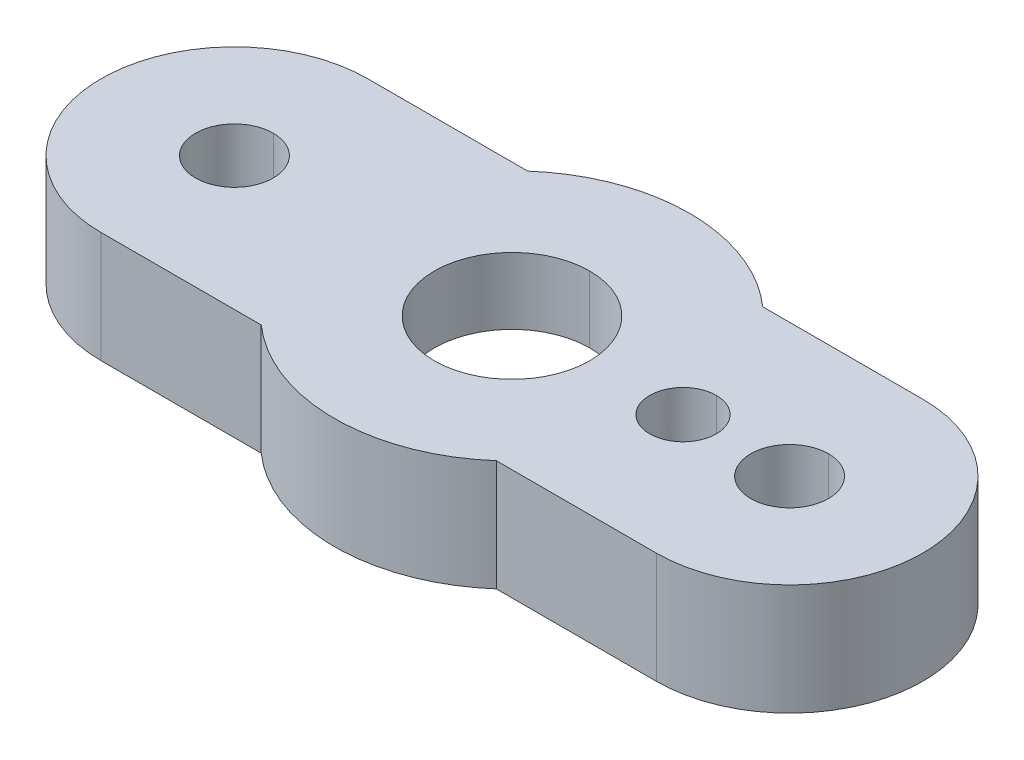
ISO-10303-21;
HEADER;
FILE_DESCRIPTION(('STEP AP214'),'2;1');
FILE_NAME('part.step','',(''),(''),'','','');
FILE_SCHEMA(('AUTOMOTIVE_DESIGN { 1 0 10303 214 1 1 1 1 }'));
ENDSEC;
DATA;
#1=APPLICATION_CONTEXT('core data for automotive mechanical design processes');
#2=APPLICATION_PROTOCOL_DEFINITION('international standard','automotive_design',2000,#1);
#3=PRODUCT_CONTEXT('',#1,'mechanical');
#4=PRODUCT('Part','Part','',(#3));
#5=PRODUCT_RELATED_PRODUCT_CATEGORY('part','',(#4));
#6=PRODUCT_DEFINITION_FORMATION('','',#4);
#7=PRODUCT_DEFINITION_CONTEXT('part definition',#1,'design');
#8=PRODUCT_DEFINITION('design','',#6,#7);
#9=PRODUCT_DEFINITION_SHAPE('','',#8);
#10=(LENGTH_UNIT() NAMED_UNIT(*) SI_UNIT(.MILLI.,.METRE.));
#11=(NAMED_UNIT(*) PLANE_ANGLE_UNIT() SI_UNIT($,.RADIAN.));
#12=(NAMED_UNIT(*) SI_UNIT($,.STERADIAN.) SOLID_ANGLE_UNIT());
#13=UNCERTAINTY_MEASURE_WITH_UNIT(LENGTH_MEASURE(1.E-05),#10,'distance_accuracy_value','');
#14=(GEOMETRIC_REPRESENTATION_CONTEXT(3) GLOBAL_UNCERTAINTY_ASSIGNED_CONTEXT((#13)) GLOBAL_UNIT_ASSIGNED_CONTEXT((#10,
#11,#12)) REPRESENTATION_CONTEXT('',''));
#15=CARTESIAN_POINT('',(0.,0.,0.));
#16=DIRECTION('',(0.,0.,1.));
#17=DIRECTION('',(1.,0.,0.));
#18=AXIS2_PLACEMENT_3D('',#15,#16,#17);
#19=CARTESIAN_POINT('',(7.7,-0.00100000000000013,0.));
#20=DIRECTION('',(0.,1.,0.));
#21=DIRECTION('',(0.,0.,1.));
#22=AXIS2_PLACEMENT_3D('',#19,#20,#21);
#23=CYLINDRICAL_SURFACE('',#22,1.5);
#24=DIRECTION('',(0.,1.,0.));
#25=VECTOR('',#24,1.);
#26=CARTESIAN_POINT('',(7.7,-0.00100000000000013,-1.5));
#27=LINE('',#26,#25);
#28=CARTESIAN_POINT('',(7.7,0.,-1.5));
#29=VERTEX_POINT('',#28);
#30=CARTESIAN_POINT('',(7.7,5.,-1.5));
#31=VERTEX_POINT('',#30);
#32=EDGE_CURVE('E241',#29,#31,#27,.T.);
#33=ORIENTED_EDGE('',*,*,#32,.F.);
#34=CARTESIAN_POINT('',(7.7,0.,0.));
#35=DIRECTION('',(0.,-1.,0.));
#36=DIRECTION('',(0.,0.,1.));
#37=AXIS2_PLACEMENT_3D('',#34,#35,#36);
#38=CIRCLE('',#37,1.5);
#39=CARTESIAN_POINT('',(7.7,0.,1.5));
#40=VERTEX_POINT('',#39);
#41=EDGE_CURVE('E238',#29,#40,#38,.T.);
#42=ORIENTED_EDGE('',*,*,#41,.T.);
#43=DIRECTION('',(0.,1.,0.));
#44=VECTOR('',#43,1.);
#45=CARTESIAN_POINT('',(7.7,-0.00100000000000013,1.5));
#46=LINE('',#45,#44);
#47=CARTESIAN_POINT('',(7.7,5.,1.5));
#48=VERTEX_POINT('',#47);
#49=EDGE_CURVE('E256',#40,#48,#46,.T.);
#50=ORIENTED_EDGE('',*,*,#49,.T.);
#51=CARTESIAN_POINT('',(7.7,5.,0.));
#52=DIRECTION('',(0.,1.,0.));
#53=DIRECTION('',(0.,0.,1.));
#54=AXIS2_PLACEMENT_3D('',#51,#52,#53);
#55=CIRCLE('',#54,1.5);
#56=EDGE_CURVE('E403',#48,#31,#55,.T.);
#57=ORIENTED_EDGE('',*,*,#56,.T.);
#58=EDGE_LOOP('',(#33,#42,#50,#57));
#59=FACE_BOUND('',#58,.T.);
#60=ADVANCED_FACE('F17',(#59),#23,.F.);
#61=CARTESIAN_POINT('',(-12.5,22.8455709626008,0.));
#62=DIRECTION('',(0.,-1.,0.));
#63=DIRECTION('',(0.,0.,-1.));
#64=AXIS2_PLACEMENT_3D('',#61,#62,#63);
#65=CYLINDRICAL_SURFACE('',#64,1.75);
#66=DIRECTION('',(0.,-1.,0.));
#67=VECTOR('',#66,1.);
#68=CARTESIAN_POINT('',(-12.5,22.8455709626008,1.75));
#69=LINE('',#68,#67);
#70=CARTESIAN_POINT('',(-12.5,5.,1.75));
#71=VERTEX_POINT('',#70);
#72=CARTESIAN_POINT('',(-12.5,0.,1.75));
#73=VERTEX_POINT('',#72);
#74=EDGE_CURVE('E297',#71,#73,#69,.T.);
#75=ORIENTED_EDGE('',*,*,#74,.F.);
#76=CARTESIAN_POINT('',(-12.5,5.,0.));
#77=DIRECTION('',(0.,-1.,0.));
#78=DIRECTION('',(0.,0.,1.));
#79=AXIS2_PLACEMENT_3D('',#76,#77,#78);
#80=CIRCLE('',#79,1.75);
#81=CARTESIAN_POINT('',(-12.5,5.,-1.75));
#82=VERTEX_POINT('',#81);
#83=EDGE_CURVE('E409',#82,#71,#80,.T.);
#84=ORIENTED_EDGE('',*,*,#83,.F.);
#85=DIRECTION('',(0.,-1.,0.));
#86=VECTOR('',#85,1.);
#87=CARTESIAN_POINT('',(-12.5,22.8455709626008,-1.75));
#88=LINE('',#87,#86);
#89=CARTESIAN_POINT('',(-12.5,0.,-1.75));
#90=VERTEX_POINT('',#89);
#91=EDGE_CURVE('E271',#82,#90,#88,.T.);
#92=ORIENTED_EDGE('',*,*,#91,.T.);
#93=CARTESIAN_POINT('',(-12.5,0.,0.));
#94=DIRECTION('',(0.,-1.,0.));
#95=DIRECTION('',(0.,0.,-1.));
#96=AXIS2_PLACEMENT_3D('',#93,#94,#95);
#97=CIRCLE('',#96,1.75);
#98=EDGE_CURVE('E355',#90,#73,#97,.T.);
#99=ORIENTED_EDGE('',*,*,#98,.T.);
#100=EDGE_LOOP('',(#75,#84,#92,#99));
#101=FACE_BOUND('',#100,.T.);
#102=ADVANCED_FACE('F466',(#101),#65,.F.);
#103=CARTESIAN_POINT('',(-12.5,22.8455709626008,-6.));
#104=DIRECTION('',(0.,0.,-1.));
#105=DIRECTION('',(0.,-1.,0.));
#106=AXIS2_PLACEMENT_3D('',#103,#104,#105);
#107=PLANE('',#106);
#108=DIRECTION('',(0.,-1.,0.));
#109=VECTOR('',#108,1.);
#110=CARTESIAN_POINT('',(-12.5,22.8455709626008,-6.));
#111=LINE('',#110,#109);
#112=CARTESIAN_POINT('',(-12.5,5.,-6.));
#113=VERTEX_POINT('',#112);
#114=CARTESIAN_POINT('',(-12.5,0.,-6.));
#115=VERTEX_POINT('',#114);
#116=EDGE_CURVE('E11',#113,#115,#111,.T.);
#117=ORIENTED_EDGE('',*,*,#116,.F.);
#118=DIRECTION('',(1.,0.,0.));
#119=VECTOR('',#118,1.);
#120=CARTESIAN_POINT('',(-12.5,5.,-6.));
#121=LINE('',#120,#119);
#122=CARTESIAN_POINT('',(-5.29150262212918,5.,-6.));
#123=VERTEX_POINT('',#122);
#124=EDGE_CURVE('E383',#113,#123,#121,.T.);
#125=ORIENTED_EDGE('',*,*,#124,.T.);
#126=DIRECTION('',(0.,-1.,0.));
#127=VECTOR('',#126,1.);
#128=CARTESIAN_POINT('',(-5.29150262212918,22.8455709626008,-6.));
#129=LINE('',#128,#127);
#130=CARTESIAN_POINT('',(-5.29150262212918,0.,-6.));
#131=VERTEX_POINT('',#130);
#132=EDGE_CURVE('E315',#123,#131,#129,.T.);
#133=ORIENTED_EDGE('',*,*,#132,.T.);
#134=DIRECTION('',(1.,0.,0.));
#135=VECTOR('',#134,1.);
#136=CARTESIAN_POINT('',(-12.5,0.,-6.));
#137=LINE('',#136,#135);
#138=EDGE_CURVE('E252',#115,#131,#137,.T.);
#139=ORIENTED_EDGE('',*,*,#138,.F.);
#140=EDGE_LOOP('',(#117,#125,#133,#139));
#141=FACE_BOUND('',#140,.T.);
#142=ADVANCED_FACE('F471',(#141),#107,.T.);
#143=CARTESIAN_POINT('',(-5.29150262212918,22.8455709626008,6.));
#144=DIRECTION('',(0.,0.,1.));
#145=DIRECTION('',(1.,0.,0.));
#146=AXIS2_PLACEMENT_3D('',#143,#144,#145);
#147=PLANE('',#146);
#148=DIRECTION('',(0.,-1.,0.));
#149=VECTOR('',#148,1.);
#150=CARTESIAN_POINT('',(-5.29150262212918,22.8455709626008,6.));
#151=LINE('',#150,#149);
#152=CARTESIAN_POINT('',(-5.29150262212918,5.,6.));
#153=VERTEX_POINT('',#152);
#154=CARTESIAN_POINT('',(-5.29150262212918,0.,6.));
#155=VERTEX_POINT('',#154);
#156=EDGE_CURVE('E367',#153,#155,#151,.T.);
#157=ORIENTED_EDGE('',*,*,#156,.F.);
#158=DIRECTION('',(-1.,0.,0.));
#159=VECTOR('',#158,1.);
#160=CARTESIAN_POINT('',(-5.29150262212918,5.,6.));
#161=LINE('',#160,#159);
#162=CARTESIAN_POINT('',(-12.5,5.,6.));
#163=VERTEX_POINT('',#162);
#164=EDGE_CURVE('E389',#153,#163,#161,.T.);
#165=ORIENTED_EDGE('',*,*,#164,.T.);
#166=DIRECTION('',(0.,-1.,0.));
#167=VECTOR('',#166,1.);
#168=CARTESIAN_POINT('',(-12.5,22.8455709626008,6.));
#169=LINE('',#168,#167);
#170=CARTESIAN_POINT('',(-12.5,0.,6.));
#171=VERTEX_POINT('',#170);
#172=EDGE_CURVE('E20',#163,#171,#169,.T.);
#173=ORIENTED_EDGE('',*,*,#172,.T.);
#174=DIRECTION('',(-1.,0.,0.));
#175=VECTOR('',#174,1.);
#176=CARTESIAN_POINT('',(-5.29150262212918,0.,6.));
#177=LINE('',#176,#175);
#178=EDGE_CURVE('E426',#155,#171,#177,.T.);
#179=ORIENTED_EDGE('',*,*,#178,.F.);
#180=EDGE_LOOP('',(#157,#165,#173,#179));
#181=FACE_BOUND('',#180,.T.);
#182=ADVANCED_FACE('F475',(#181),#147,.T.);
#183=CARTESIAN_POINT('',(-12.5,22.8455709626008,0.));
#184=DIRECTION('',(0.,-1.,0.));
#185=DIRECTION('',(0.,0.,-1.));
#186=AXIS2_PLACEMENT_3D('',#183,#184,#185);
#187=CYLINDRICAL_SURFACE('',#186,6.);
#188=ORIENTED_EDGE('',*,*,#172,.F.);
#189=CARTESIAN_POINT('',(-12.5,5.,0.));
#190=DIRECTION('',(0.,-1.,0.));
#191=DIRECTION('',(0.,0.,1.));
#192=AXIS2_PLACEMENT_3D('',#189,#190,#191);
#193=CIRCLE('',#192,6.);
#194=EDGE_CURVE('E386',#163,#113,#193,.T.);
#195=ORIENTED_EDGE('',*,*,#194,.T.);
#196=ORIENTED_EDGE('',*,*,#116,.T.);
#197=CARTESIAN_POINT('',(-12.5,0.,0.));
#198=DIRECTION('',(0.,-1.,0.));
#199=DIRECTION('',(0.,0.,-1.));
#200=AXIS2_PLACEMENT_3D('',#197,#198,#199);
#201=CIRCLE('',#200,6.);
#202=EDGE_CURVE('E430',#171,#115,#201,.T.);
#203=ORIENTED_EDGE('',*,*,#202,.F.);
#204=EDGE_LOOP('',(#188,#195,#196,#203));
#205=FACE_BOUND('',#204,.T.);
#206=ADVANCED_FACE('F483',(#205),#187,.T.);
#207=CARTESIAN_POINT('',(12.5,22.8455709626008,0.));
#208=DIRECTION('',(0.,-1.,0.));
#209=DIRECTION('',(0.,0.,-1.));
#210=AXIS2_PLACEMENT_3D('',#207,#208,#209);
#211=CYLINDRICAL_SURFACE('',#210,1.75);
#212=DIRECTION('',(0.,-1.,0.));
#213=VECTOR('',#212,1.);
#214=CARTESIAN_POINT('',(12.5,22.8455709626008,1.75));
#215=LINE('',#214,#213);
#216=CARTESIAN_POINT('',(12.5,5.,1.75));
#217=VERTEX_POINT('',#216);
#218=CARTESIAN_POINT('',(12.5,0.,1.75));
#219=VERTEX_POINT('',#218);
#220=EDGE_CURVE('E277',#217,#219,#215,.T.);
#221=ORIENTED_EDGE('',*,*,#220,.F.);
#222=CARTESIAN_POINT('',(12.5,5.,0.));
#223=DIRECTION('',(0.,-1.,0.));
#224=DIRECTION('',(0.,0.,1.));
#225=AXIS2_PLACEMENT_3D('',#222,#223,#224);
#226=CIRCLE('',#225,1.75);
#227=CARTESIAN_POINT('',(12.5,5.,-1.75));
#228=VERTEX_POINT('',#227);
#229=EDGE_CURVE('E406',#228,#217,#226,.T.);
#230=ORIENTED_EDGE('',*,*,#229,.F.);
#231=DIRECTION('',(0.,-1.,0.));
#232=VECTOR('',#231,1.);
#233=CARTESIAN_POINT('',(12.5,22.8455709626008,-1.75));
#234=LINE('',#233,#232);
#235=CARTESIAN_POINT('',(12.5,0.,-1.75));
#236=VERTEX_POINT('',#235);
#237=EDGE_CURVE('E287',#228,#236,#234,.T.);
#238=ORIENTED_EDGE('',*,*,#237,.T.);
#239=CARTESIAN_POINT('',(12.5,0.,0.));
#240=DIRECTION('',(0.,-1.,0.));
#241=DIRECTION('',(0.,0.,-1.));
#242=AXIS2_PLACEMENT_3D('',#239,#240,#241);
#243=CIRCLE('',#242,1.75);
#244=EDGE_CURVE('E300',#236,#219,#243,.T.);
#245=ORIENTED_EDGE('',*,*,#244,.T.);
#246=EDGE_LOOP('',(#221,#230,#238,#245));
#247=FACE_BOUND('',#246,.T.);
#248=ADVANCED_FACE('F491',(#247),#211,.F.);
#249=CARTESIAN_POINT('',(12.5,22.8455709626008,6.));
#250=DIRECTION('',(0.,0.,1.));
#251=DIRECTION('',(1.,0.,0.));
#252=AXIS2_PLACEMENT_3D('',#249,#250,#251);
#253=PLANE('',#252);
#254=DIRECTION('',(0.,-1.,0.));
#255=VECTOR('',#254,1.);
#256=CARTESIAN_POINT('',(12.5,22.8455709626008,6.));
#257=LINE('',#256,#255);
#258=CARTESIAN_POINT('',(12.5,5.,6.));
#259=VERTEX_POINT('',#258);
#260=CARTESIAN_POINT('',(12.5,0.,6.));
#261=VERTEX_POINT('',#260);
#262=EDGE_CURVE('E441',#259,#261,#257,.T.);
#263=ORIENTED_EDGE('',*,*,#262,.F.);
#264=DIRECTION('',(-1.,0.,0.));
#265=VECTOR('',#264,1.);
#266=CARTESIAN_POINT('',(12.5,5.,6.));
#267=LINE('',#266,#265);
#268=CARTESIAN_POINT('',(5.29150262212918,5.,6.));
#269=VERTEX_POINT('',#268);
#270=EDGE_CURVE('E392',#259,#269,#267,.T.);
#271=ORIENTED_EDGE('',*,*,#270,.T.);
#272=DIRECTION('',(0.,-1.,0.));
#273=VECTOR('',#272,1.);
#274=CARTESIAN_POINT('',(5.29150262212918,22.8455709626008,6.));
#275=LINE('',#274,#273);
#276=CARTESIAN_POINT('',(5.29150262212918,0.,6.));
#277=VERTEX_POINT('',#276);
#278=EDGE_CURVE('E345',#269,#277,#275,.T.);
#279=ORIENTED_EDGE('',*,*,#278,.T.);
#280=DIRECTION('',(-1.,0.,0.));
#281=VECTOR('',#280,1.);
#282=CARTESIAN_POINT('',(12.5,0.,6.));
#283=LINE('',#282,#281);
#284=EDGE_CURVE('E414',#261,#277,#283,.T.);
#285=ORIENTED_EDGE('',*,*,#284,.F.);
#286=EDGE_LOOP('',(#263,#271,#279,#285));
#287=FACE_BOUND('',#286,.T.);
#288=ADVANCED_FACE('F499',(#287),#253,.T.);
#289=CARTESIAN_POINT('',(5.29150262212918,22.8455709626008,-6.));
#290=DIRECTION('',(0.,0.,-1.));
#291=DIRECTION('',(0.,-1.,0.));
#292=AXIS2_PLACEMENT_3D('',#289,#290,#291);
#293=PLANE('',#292);
#294=DIRECTION('',(0.,-1.,0.));
#295=VECTOR('',#294,1.);
#296=CARTESIAN_POINT('',(5.29150262212918,22.8455709626008,-6.));
#297=LINE('',#296,#295);
#298=CARTESIAN_POINT('',(5.29150262212918,5.,-6.));
#299=VERTEX_POINT('',#298);
#300=CARTESIAN_POINT('',(5.29150262212918,0.,-6.));
#301=VERTEX_POINT('',#300);
#302=EDGE_CURVE('E330',#299,#301,#297,.T.);
#303=ORIENTED_EDGE('',*,*,#302,.F.);
#304=DIRECTION('',(1.,0.,0.));
#305=VECTOR('',#304,1.);
#306=CARTESIAN_POINT('',(5.29150262212918,5.,-6.));
#307=LINE('',#306,#305);
#308=CARTESIAN_POINT('',(12.5,5.,-6.));
#309=VERTEX_POINT('',#308);
#310=EDGE_CURVE('E399',#299,#309,#307,.T.);
#311=ORIENTED_EDGE('',*,*,#310,.T.);
#312=DIRECTION('',(0.,-1.,0.));
#313=VECTOR('',#312,1.);
#314=CARTESIAN_POINT('',(12.5,22.8455709626008,-6.));
#315=LINE('',#314,#313);
#316=CARTESIAN_POINT('',(12.5,0.,-6.));
#317=VERTEX_POINT('',#316);
#318=EDGE_CURVE('E329',#309,#317,#315,.T.);
#319=ORIENTED_EDGE('',*,*,#318,.T.);
#320=DIRECTION('',(1.,0.,0.));
#321=VECTOR('',#320,1.);
#322=CARTESIAN_POINT('',(5.29150262212918,0.,-6.));
#323=LINE('',#322,#321);
#324=EDGE_CURVE('E415',#301,#317,#323,.T.);
#325=ORIENTED_EDGE('',*,*,#324,.F.);
#326=EDGE_LOOP('',(#303,#311,#319,#325));
#327=FACE_BOUND('',#326,.T.);
#328=ADVANCED_FACE('F508',(#327),#293,.T.);
#329=CARTESIAN_POINT('',(12.5,22.8455709626008,0.));
#330=DIRECTION('',(0.,-1.,0.));
#331=DIRECTION('',(0.,0.,-1.));
#332=AXIS2_PLACEMENT_3D('',#329,#330,#331);
#333=CYLINDRICAL_SURFACE('',#332,6.);
#334=ORIENTED_EDGE('',*,*,#318,.F.);
#335=CARTESIAN_POINT('',(12.5,5.,0.));
#336=DIRECTION('',(0.,-1.,0.));
#337=DIRECTION('',(0.,0.,1.));
#338=AXIS2_PLACEMENT_3D('',#335,#336,#337);
#339=CIRCLE('',#338,6.);
#340=EDGE_CURVE('E395',#309,#259,#339,.T.);
#341=ORIENTED_EDGE('',*,*,#340,.T.);
#342=ORIENTED_EDGE('',*,*,#262,.T.);
#343=CARTESIAN_POINT('',(12.5,0.,0.));
#344=DIRECTION('',(0.,-1.,0.));
#345=DIRECTION('',(0.,0.,-1.));
#346=AXIS2_PLACEMENT_3D('',#343,#344,#345);
#347=CIRCLE('',#346,6.);
#348=EDGE_CURVE('E410',#317,#261,#347,.T.);
#349=ORIENTED_EDGE('',*,*,#348,.F.);
#350=EDGE_LOOP('',(#334,#341,#342,#349));
#351=FACE_BOUND('',#350,.T.);
#352=ADVANCED_FACE('F519',(#351),#333,.T.);
#353=CARTESIAN_POINT('',(0.,2.,0.));
#354=DIRECTION('',(0.,-1.,0.));
#355=DIRECTION('',(0.,0.,-1.));
#356=AXIS2_PLACEMENT_3D('',#353,#354,#355);
#357=PLANE('',#356);
#358=CARTESIAN_POINT('',(0.,2.,0.));
#359=DIRECTION('',(0.,-1.,0.));
#360=DIRECTION('',(0.,0.,-1.));
#361=AXIS2_PLACEMENT_3D('',#358,#359,#360);
#362=CIRCLE('',#361,3.5);
#363=CARTESIAN_POINT('',(0.,2.,-3.5));
#364=VERTEX_POINT('',#363);
#365=CARTESIAN_POINT('',(0.,2.,3.5));
#366=VERTEX_POINT('',#365);
#367=EDGE_CURVE('E344',#364,#366,#362,.T.);
#368=ORIENTED_EDGE('',*,*,#367,.F.);
#369=CARTESIAN_POINT('',(0.,2.,0.));
#370=DIRECTION('',(0.,-1.,0.));
#371=DIRECTION('',(0.,0.,-1.));
#372=AXIS2_PLACEMENT_3D('',#369,#370,#371);
#373=CIRCLE('',#372,3.5);
#374=EDGE_CURVE('E352',#366,#364,#373,.T.);
#375=ORIENTED_EDGE('',*,*,#374,.F.);
#376=EDGE_LOOP('',(#368,#375));
#377=FACE_BOUND('',#376,.T.);
#378=CARTESIAN_POINT('',(7.7,2.,0.));
#379=DIRECTION('',(0.,1.,0.));
#380=DIRECTION('',(0.,0.,-1.));
#381=AXIS2_PLACEMENT_3D('',#378,#379,#380);
#382=CIRCLE('',#381,1.5);
#383=CARTESIAN_POINT('',(6.4474025974026,2.,-0.825227088143765));
#384=VERTEX_POINT('',#383);
#385=CARTESIAN_POINT('',(6.4474025974026,2.,0.825227088143765));
#386=VERTEX_POINT('',#385);
#387=EDGE_CURVE('E231',#384,#386,#382,.T.);
#388=ORIENTED_EDGE('',*,*,#387,.T.);
#389=CARTESIAN_POINT('',(0.,2.,0.));
#390=DIRECTION('',(0.,-1.,0.));
#391=DIRECTION('',(0.,0.,-1.));
#392=AXIS2_PLACEMENT_3D('',#389,#390,#391);
#393=CIRCLE('',#392,6.5);
#394=CARTESIAN_POINT('',(0.,2.,6.5));
#395=VERTEX_POINT('',#394);
#396=EDGE_CURVE('E326',#386,#395,#393,.T.);
#397=ORIENTED_EDGE('',*,*,#396,.T.);
#398=CARTESIAN_POINT('',(0.,2.,0.));
#399=DIRECTION('',(0.,-1.,0.));
#400=DIRECTION('',(0.,0.,-1.));
#401=AXIS2_PLACEMENT_3D('',#398,#399,#400);
#402=CIRCLE('',#401,6.5);
#403=CARTESIAN_POINT('',(0.,2.,-6.5));
#404=VERTEX_POINT('',#403);
#405=EDGE_CURVE('E291',#395,#404,#402,.T.);
#406=ORIENTED_EDGE('',*,*,#405,.T.);
#407=CARTESIAN_POINT('',(0.,2.,0.));
#408=DIRECTION('',(0.,-1.,0.));
#409=DIRECTION('',(0.,0.,-1.));
#410=AXIS2_PLACEMENT_3D('',#407,#408,#409);
#411=CIRCLE('',#410,6.5);
#412=EDGE_CURVE('E222',#404,#384,#411,.T.);
#413=ORIENTED_EDGE('',*,*,#412,.T.);
#414=EDGE_LOOP('',(#388,#397,#406,#413));
#415=FACE_BOUND('',#414,.T.);
#416=ADVANCED_FACE('F514',(#377,#415),#357,.T.);
#417=CARTESIAN_POINT('',(0.,2.,0.));
#418=DIRECTION('',(0.,-1.,0.));
#419=DIRECTION('',(0.,0.,-1.));
#420=AXIS2_PLACEMENT_3D('',#417,#418,#419);
#421=CYLINDRICAL_SURFACE('',#420,6.5);
#422=DIRECTION('',(0.,-1.,0.));
#423=VECTOR('',#422,1.);
#424=CARTESIAN_POINT('',(0.,2.,6.5));
#425=LINE('',#424,#423);
#426=CARTESIAN_POINT('',(0.,0.,6.5));
#427=VERTEX_POINT('',#426);
#428=EDGE_CURVE('E319',#395,#427,#425,.T.);
#429=ORIENTED_EDGE('',*,*,#428,.F.);
#430=ORIENTED_EDGE('',*,*,#396,.F.);
#431=DIRECTION('',(0.,1.,0.));
#432=VECTOR('',#431,1.);
#433=CARTESIAN_POINT('',(6.4474025974026,1.,0.825227088143766));
#434=LINE('',#433,#432);
#435=CARTESIAN_POINT('',(6.4474025974026,0.,0.825227088143765));
#436=VERTEX_POINT('',#435);
#437=EDGE_CURVE('E270',#436,#386,#434,.T.);
#438=ORIENTED_EDGE('',*,*,#437,.F.);
#439=CARTESIAN_POINT('',(0.,0.,0.));
#440=DIRECTION('',(0.,-1.,0.));
#441=DIRECTION('',(0.,0.,-1.));
#442=AXIS2_PLACEMENT_3D('',#439,#440,#441);
#443=CIRCLE('',#442,6.5);
#444=EDGE_CURVE('E250',#436,#427,#443,.T.);
#445=ORIENTED_EDGE('',*,*,#444,.T.);
#446=EDGE_LOOP('',(#429,#430,#438,#445));
#447=FACE_BOUND('',#446,.T.);
#448=ADVANCED_FACE('F518',(#447),#421,.F.);
#449=CARTESIAN_POINT('',(0.,5.,0.));
#450=DIRECTION('',(0.,-1.,0.));
#451=DIRECTION('',(0.,0.,-1.));
#452=AXIS2_PLACEMENT_3D('',#449,#450,#451);
#453=CYLINDRICAL_SURFACE('',#452,8.);
#454=DIRECTION('',(0.,-1.,0.));
#455=VECTOR('',#454,1.);
#456=CARTESIAN_POINT('',(0.,5.,-8.));
#457=LINE('',#456,#455);
#458=CARTESIAN_POINT('',(0.,5.,-8.));
#459=VERTEX_POINT('',#458);
#460=CARTESIAN_POINT('',(0.,0.,-8.));
#461=VERTEX_POINT('',#460);
#462=EDGE_CURVE('E258',#459,#461,#457,.T.);
#463=ORIENTED_EDGE('',*,*,#462,.F.);
#464=CARTESIAN_POINT('',(0.,5.,0.));
#465=DIRECTION('',(0.,1.,0.));
#466=DIRECTION('',(0.,0.,1.));
#467=AXIS2_PLACEMENT_3D('',#464,#465,#466);
#468=CIRCLE('',#467,8.);
#469=EDGE_CURVE('E380',#299,#459,#468,.T.);
#470=ORIENTED_EDGE('',*,*,#469,.F.);
#471=ORIENTED_EDGE('',*,*,#302,.T.);
#472=CARTESIAN_POINT('',(0.,0.,0.));
#473=DIRECTION('',(0.,1.,0.));
#474=DIRECTION('',(0.,0.,1.));
#475=AXIS2_PLACEMENT_3D('',#472,#473,#474);
#476=CIRCLE('',#475,8.);
#477=EDGE_CURVE('E418',#301,#461,#476,.T.);
#478=ORIENTED_EDGE('',*,*,#477,.T.);
#479=EDGE_LOOP('',(#463,#470,#471,#478));
#480=FACE_BOUND('',#479,.T.);
#481=ADVANCED_FACE('F525',(#480),#453,.T.);
#482=CARTESIAN_POINT('',(0.,0.,0.));
#483=DIRECTION('',(0.,1.,0.));
#484=DIRECTION('',(1.,0.,0.));
#485=AXIS2_PLACEMENT_3D('',#482,#483,#484);
#486=PLANE('',#485);
#487=ORIENTED_EDGE('',*,*,#98,.F.);
#488=CARTESIAN_POINT('',(-12.5,0.,0.));
#489=DIRECTION('',(0.,-1.,0.));
#490=DIRECTION('',(0.,0.,-1.));
#491=AXIS2_PLACEMENT_3D('',#488,#489,#490);
#492=CIRCLE('',#491,1.75);
#493=EDGE_CURVE('E276',#73,#90,#492,.T.);
#494=ORIENTED_EDGE('',*,*,#493,.F.);
#495=EDGE_LOOP('',(#487,#494));
#496=FACE_BOUND('',#495,.T.);
#497=ORIENTED_EDGE('',*,*,#244,.F.);
#498=CARTESIAN_POINT('',(12.5,0.,0.));
#499=DIRECTION('',(0.,-1.,0.));
#500=DIRECTION('',(0.,0.,-1.));
#501=AXIS2_PLACEMENT_3D('',#498,#499,#500);
#502=CIRCLE('',#501,1.75);
#503=EDGE_CURVE('E281',#219,#236,#502,.T.);
#504=ORIENTED_EDGE('',*,*,#503,.F.);
#505=EDGE_LOOP('',(#497,#504));
#506=FACE_BOUND('',#505,.T.);
#507=ORIENTED_EDGE('',*,*,#444,.F.);
#508=CARTESIAN_POINT('',(7.7,0.,0.));
#509=DIRECTION('',(0.,-1.,0.));
#510=DIRECTION('',(0.,0.,1.));
#511=AXIS2_PLACEMENT_3D('',#508,#509,#510);
#512=CIRCLE('',#511,1.5);
#513=EDGE_CURVE('E266',#40,#436,#512,.T.);
#514=ORIENTED_EDGE('',*,*,#513,.F.);
#515=ORIENTED_EDGE('',*,*,#41,.F.);
#516=CARTESIAN_POINT('',(7.7,0.,0.));
#517=DIRECTION('',(0.,-1.,0.));
#518=DIRECTION('',(0.,0.,1.));
#519=AXIS2_PLACEMENT_3D('',#516,#517,#518);
#520=CIRCLE('',#519,1.5);
#521=CARTESIAN_POINT('',(6.4474025974026,0.,-0.825227088143766));
#522=VERTEX_POINT('',#521);
#523=EDGE_CURVE('E228',#522,#29,#520,.T.);
#524=ORIENTED_EDGE('',*,*,#523,.F.);
#525=CARTESIAN_POINT('',(0.,0.,0.));
#526=DIRECTION('',(0.,-1.,0.));
#527=DIRECTION('',(0.,0.,-1.));
#528=AXIS2_PLACEMENT_3D('',#525,#526,#527);
#529=CIRCLE('',#528,6.5);
#530=CARTESIAN_POINT('',(0.,0.,-6.5));
#531=VERTEX_POINT('',#530);
#532=EDGE_CURVE('E209',#531,#522,#529,.T.);
#533=ORIENTED_EDGE('',*,*,#532,.F.);
#534=CARTESIAN_POINT('',(0.,0.,0.));
#535=DIRECTION('',(0.,-1.,0.));
#536=DIRECTION('',(0.,0.,-1.));
#537=AXIS2_PLACEMENT_3D('',#534,#535,#536);
#538=CIRCLE('',#537,6.5);
#539=EDGE_CURVE('E323',#427,#531,#538,.T.);
#540=ORIENTED_EDGE('',*,*,#539,.F.);
#541=EDGE_LOOP('',(#507,#514,#515,#524,#533,#540));
#542=FACE_BOUND('',#541,.T.);
#543=ORIENTED_EDGE('',*,*,#477,.F.);
#544=ORIENTED_EDGE('',*,*,#324,.T.);
#545=ORIENTED_EDGE('',*,*,#348,.T.);
#546=ORIENTED_EDGE('',*,*,#284,.T.);
#547=CARTESIAN_POINT('',(0.,0.,0.));
#548=DIRECTION('',(0.,1.,0.));
#549=DIRECTION('',(0.,0.,1.));
#550=AXIS2_PLACEMENT_3D('',#547,#548,#549);
#551=CIRCLE('',#550,8.);
#552=EDGE_CURVE('E371',#155,#277,#551,.T.);
#553=ORIENTED_EDGE('',*,*,#552,.F.);
#554=ORIENTED_EDGE('',*,*,#178,.T.);
#555=ORIENTED_EDGE('',*,*,#202,.T.);
#556=ORIENTED_EDGE('',*,*,#138,.T.);
#557=CARTESIAN_POINT('',(0.,0.,0.));
#558=DIRECTION('',(0.,1.,0.));
#559=DIRECTION('',(0.,0.,1.));
#560=AXIS2_PLACEMENT_3D('',#557,#558,#559);
#561=CIRCLE('',#560,8.);
#562=EDGE_CURVE('E262',#461,#131,#561,.T.);
#563=ORIENTED_EDGE('',*,*,#562,.F.);
#564=EDGE_LOOP('',(#543,#544,#545,#546,#553,#554,#555,#556,#563));
#565=FACE_BOUND('',#564,.T.);
#566=ADVANCED_FACE('F235',(#496,#506,#542,#565),#486,.F.);
#567=CARTESIAN_POINT('',(0.,5.,0.));
#568=DIRECTION('',(0.,1.,0.));
#569=DIRECTION('',(1.,0.,0.));
#570=AXIS2_PLACEMENT_3D('',#567,#568,#569);
#571=PLANE('',#570);
#572=ORIENTED_EDGE('',*,*,#83,.T.);
#573=CARTESIAN_POINT('',(-12.5,5.,0.));
#574=DIRECTION('',(0.,-1.,0.));
#575=DIRECTION('',(0.,0.,1.));
#576=AXIS2_PLACEMENT_3D('',#573,#574,#575);
#577=CIRCLE('',#576,1.75);
#578=EDGE_CURVE('E233',#71,#82,#577,.T.);
#579=ORIENTED_EDGE('',*,*,#578,.T.);
#580=EDGE_LOOP('',(#572,#579));
#581=FACE_BOUND('',#580,.T.);
#582=ORIENTED_EDGE('',*,*,#229,.T.);
#583=CARTESIAN_POINT('',(12.5,5.,0.));
#584=DIRECTION('',(0.,-1.,0.));
#585=DIRECTION('',(0.,0.,1.));
#586=AXIS2_PLACEMENT_3D('',#583,#584,#585);
#587=CIRCLE('',#586,1.75);
#588=EDGE_CURVE('E275',#217,#228,#587,.T.);
#589=ORIENTED_EDGE('',*,*,#588,.T.);
#590=EDGE_LOOP('',(#582,#589));
#591=FACE_BOUND('',#590,.T.);
#592=CARTESIAN_POINT('',(0.,5.,0.));
#593=DIRECTION('',(0.,1.,0.));
#594=DIRECTION('',(0.,0.,1.));
#595=AXIS2_PLACEMENT_3D('',#592,#593,#594);
#596=CIRCLE('',#595,3.5);
#597=CARTESIAN_POINT('',(0.,5.,-3.5));
#598=VERTEX_POINT('',#597);
#599=CARTESIAN_POINT('',(0.,5.,3.5));
#600=VERTEX_POINT('',#599);
#601=EDGE_CURVE('E310',#598,#600,#596,.T.);
#602=ORIENTED_EDGE('',*,*,#601,.F.);
#603=CARTESIAN_POINT('',(0.,5.,0.));
#604=DIRECTION('',(0.,1.,0.));
#605=DIRECTION('',(0.,0.,1.));
#606=AXIS2_PLACEMENT_3D('',#603,#604,#605);
#607=CIRCLE('',#606,3.5);
#608=EDGE_CURVE('E341',#600,#598,#607,.T.);
#609=ORIENTED_EDGE('',*,*,#608,.F.);
#610=EDGE_LOOP('',(#602,#609));
#611=FACE_BOUND('',#610,.T.);
#612=ORIENTED_EDGE('',*,*,#56,.F.);
#613=CARTESIAN_POINT('',(7.7,5.,0.));
#614=DIRECTION('',(0.,1.,0.));
#615=DIRECTION('',(0.,0.,1.));
#616=AXIS2_PLACEMENT_3D('',#613,#614,#615);
#617=CIRCLE('',#616,1.5);
#618=EDGE_CURVE('E247',#31,#48,#617,.T.);
#619=ORIENTED_EDGE('',*,*,#618,.F.);
#620=EDGE_LOOP('',(#612,#619));
#621=FACE_BOUND('',#620,.T.);
#622=ORIENTED_EDGE('',*,*,#469,.T.);
#623=CARTESIAN_POINT('',(0.,5.,0.));
#624=DIRECTION('',(0.,1.,0.));
#625=DIRECTION('',(0.,0.,1.));
#626=AXIS2_PLACEMENT_3D('',#623,#624,#625);
#627=CIRCLE('',#626,8.);
#628=EDGE_CURVE('E221',#459,#123,#627,.T.);
#629=ORIENTED_EDGE('',*,*,#628,.T.);
#630=ORIENTED_EDGE('',*,*,#124,.F.);
#631=ORIENTED_EDGE('',*,*,#194,.F.);
#632=ORIENTED_EDGE('',*,*,#164,.F.);
#633=CARTESIAN_POINT('',(0.,5.,0.));
#634=DIRECTION('',(0.,1.,0.));
#635=DIRECTION('',(0.,0.,1.));
#636=AXIS2_PLACEMENT_3D('',#633,#634,#635);
#637=CIRCLE('',#636,8.);
#638=EDGE_CURVE('E363',#153,#269,#637,.T.);
#639=ORIENTED_EDGE('',*,*,#638,.T.);
#640=ORIENTED_EDGE('',*,*,#270,.F.);
#641=ORIENTED_EDGE('',*,*,#340,.F.);
#642=ORIENTED_EDGE('',*,*,#310,.F.);
#643=EDGE_LOOP('',(#622,#629,#630,#631,#632,#639,#640,#641,#642));
#644=FACE_BOUND('',#643,.T.);
#645=ADVANCED_FACE('F545',(#581,#591,#611,#621,#644),#571,.T.);
#646=CARTESIAN_POINT('',(0.,5.,0.));
#647=DIRECTION('',(0.,-1.,0.));
#648=DIRECTION('',(0.,0.,-1.));
#649=AXIS2_PLACEMENT_3D('',#646,#647,#648);
#650=CYLINDRICAL_SURFACE('',#649,3.5);
#651=DIRECTION('',(0.,-1.,0.));
#652=VECTOR('',#651,1.);
#653=CARTESIAN_POINT('',(0.,5.,3.5));
#654=LINE('',#653,#652);
#655=EDGE_CURVE('E314',#600,#366,#654,.T.);
#656=ORIENTED_EDGE('',*,*,#655,.F.);
#657=ORIENTED_EDGE('',*,*,#608,.T.);
#658=DIRECTION('',(0.,-1.,0.));
#659=VECTOR('',#658,1.);
#660=CARTESIAN_POINT('',(0.,5.,-3.5));
#661=LINE('',#660,#659);
#662=EDGE_CURVE('E359',#598,#364,#661,.T.);
#663=ORIENTED_EDGE('',*,*,#662,.T.);
#664=ORIENTED_EDGE('',*,*,#367,.T.);
#665=EDGE_LOOP('',(#656,#657,#663,#664));
#666=FACE_BOUND('',#665,.T.);
#667=ADVANCED_FACE('F556',(#666),#650,.F.);
#668=CARTESIAN_POINT('',(0.,5.,0.));
#669=DIRECTION('',(0.,-1.,0.));
#670=DIRECTION('',(0.,0.,-1.));
#671=AXIS2_PLACEMENT_3D('',#668,#669,#670);
#672=CYLINDRICAL_SURFACE('',#671,8.);
#673=ORIENTED_EDGE('',*,*,#638,.F.);
#674=ORIENTED_EDGE('',*,*,#156,.T.);
#675=ORIENTED_EDGE('',*,*,#552,.T.);
#676=ORIENTED_EDGE('',*,*,#278,.F.);
#677=EDGE_LOOP('',(#673,#674,#675,#676));
#678=FACE_BOUND('',#677,.T.);
#679=ADVANCED_FACE('F551',(#678),#672,.T.);
#680=CARTESIAN_POINT('',(0.,5.,0.));
#681=DIRECTION('',(0.,-1.,0.));
#682=DIRECTION('',(0.,0.,-1.));
#683=AXIS2_PLACEMENT_3D('',#680,#681,#682);
#684=CYLINDRICAL_SURFACE('',#683,3.5);
#685=ORIENTED_EDGE('',*,*,#601,.T.);
#686=ORIENTED_EDGE('',*,*,#655,.T.);
#687=ORIENTED_EDGE('',*,*,#374,.T.);
#688=ORIENTED_EDGE('',*,*,#662,.F.);
#689=EDGE_LOOP('',(#685,#686,#687,#688));
#690=FACE_BOUND('',#689,.T.);
#691=ADVANCED_FACE('F555',(#690),#684,.F.);
#692=CARTESIAN_POINT('',(0.,5.,0.));
#693=DIRECTION('',(0.,-1.,0.));
#694=DIRECTION('',(0.,0.,-1.));
#695=AXIS2_PLACEMENT_3D('',#692,#693,#694);
#696=CYLINDRICAL_SURFACE('',#695,8.);
#697=ORIENTED_EDGE('',*,*,#628,.F.);
#698=ORIENTED_EDGE('',*,*,#462,.T.);
#699=ORIENTED_EDGE('',*,*,#562,.T.);
#700=ORIENTED_EDGE('',*,*,#132,.F.);
#701=EDGE_LOOP('',(#697,#698,#699,#700));
#702=FACE_BOUND('',#701,.T.);
#703=ADVANCED_FACE('F589',(#702),#696,.T.);
#704=CARTESIAN_POINT('',(0.,2.,0.));
#705=DIRECTION('',(0.,-1.,0.));
#706=DIRECTION('',(0.,0.,-1.));
#707=AXIS2_PLACEMENT_3D('',#704,#705,#706);
#708=CYLINDRICAL_SURFACE('',#707,6.5);
#709=ORIENTED_EDGE('',*,*,#412,.F.);
#710=DIRECTION('',(0.,-1.,0.));
#711=VECTOR('',#710,1.);
#712=CARTESIAN_POINT('',(0.,2.,-6.5));
#713=LINE('',#712,#711);
#714=EDGE_CURVE('E215',#404,#531,#713,.T.);
#715=ORIENTED_EDGE('',*,*,#714,.T.);
#716=ORIENTED_EDGE('',*,*,#532,.T.);
#717=DIRECTION('',(0.,-1.,0.));
#718=VECTOR('',#717,1.);
#719=CARTESIAN_POINT('',(6.4474025974026,1.,-0.825227088143766));
#720=LINE('',#719,#718);
#721=EDGE_CURVE('E212',#384,#522,#720,.T.);
#722=ORIENTED_EDGE('',*,*,#721,.F.);
#723=EDGE_LOOP('',(#709,#715,#716,#722));
#724=FACE_BOUND('',#723,.T.);
#725=ADVANCED_FACE('F211',(#724),#708,.F.);
#726=CARTESIAN_POINT('',(0.,2.,0.));
#727=DIRECTION('',(0.,-1.,0.));
#728=DIRECTION('',(0.,0.,-1.));
#729=AXIS2_PLACEMENT_3D('',#726,#727,#728);
#730=CYLINDRICAL_SURFACE('',#729,6.5);
#731=ORIENTED_EDGE('',*,*,#405,.F.);
#732=ORIENTED_EDGE('',*,*,#428,.T.);
#733=ORIENTED_EDGE('',*,*,#539,.T.);
#734=ORIENTED_EDGE('',*,*,#714,.F.);
#735=EDGE_LOOP('',(#731,#732,#733,#734));
#736=FACE_BOUND('',#735,.T.);
#737=ADVANCED_FACE('F613',(#736),#730,.F.);
#738=CARTESIAN_POINT('',(12.5,22.8455709626008,0.));
#739=DIRECTION('',(0.,-1.,0.));
#740=DIRECTION('',(0.,0.,-1.));
#741=AXIS2_PLACEMENT_3D('',#738,#739,#740);
#742=CYLINDRICAL_SURFACE('',#741,1.75);
#743=ORIENTED_EDGE('',*,*,#588,.F.);
#744=ORIENTED_EDGE('',*,*,#220,.T.);
#745=ORIENTED_EDGE('',*,*,#503,.T.);
#746=ORIENTED_EDGE('',*,*,#237,.F.);
#747=EDGE_LOOP('',(#743,#744,#745,#746));
#748=FACE_BOUND('',#747,.T.);
#749=ADVANCED_FACE('F621',(#748),#742,.F.);
#750=CARTESIAN_POINT('',(-12.5,22.8455709626008,0.));
#751=DIRECTION('',(0.,-1.,0.));
#752=DIRECTION('',(0.,0.,-1.));
#753=AXIS2_PLACEMENT_3D('',#750,#751,#752);
#754=CYLINDRICAL_SURFACE('',#753,1.75);
#755=ORIENTED_EDGE('',*,*,#578,.F.);
#756=ORIENTED_EDGE('',*,*,#74,.T.);
#757=ORIENTED_EDGE('',*,*,#493,.T.);
#758=ORIENTED_EDGE('',*,*,#91,.F.);
#759=EDGE_LOOP('',(#755,#756,#757,#758));
#760=FACE_BOUND('',#759,.T.);
#761=ADVANCED_FACE('F630',(#760),#754,.F.);
#762=CARTESIAN_POINT('',(7.7,-0.00100000000000013,0.));
#763=DIRECTION('',(0.,1.,0.));
#764=DIRECTION('',(0.,0.,1.));
#765=AXIS2_PLACEMENT_3D('',#762,#763,#764);
#766=CYLINDRICAL_SURFACE('',#765,1.5);
#767=ORIENTED_EDGE('',*,*,#523,.T.);
#768=ORIENTED_EDGE('',*,*,#32,.T.);
#769=ORIENTED_EDGE('',*,*,#618,.T.);
#770=ORIENTED_EDGE('',*,*,#49,.F.);
#771=ORIENTED_EDGE('',*,*,#513,.T.);
#772=ORIENTED_EDGE('',*,*,#437,.T.);
#773=ORIENTED_EDGE('',*,*,#387,.F.);
#774=ORIENTED_EDGE('',*,*,#721,.T.);
#775=EDGE_LOOP('',(#767,#768,#769,#770,#771,#772,#773,#774));
#776=FACE_BOUND('',#775,.T.);
#777=ADVANCED_FACE('F226',(#776),#766,.F.);
#778=CLOSED_SHELL('',(#60,#102,#142,#182,#206,#248,#288,#328,#352,#416,#448,#481,#566,#645,#667,
#679,#691,#703,#725,#737,#749,#761,#777));
#779=MANIFOLD_SOLID_BREP('B1',#778);
#780=ADVANCED_BREP_SHAPE_REPRESENTATION('',(#18,#779),#14);
#781=SHAPE_DEFINITION_REPRESENTATION(#9,#780);
ENDSEC;
END-ISO-10303-21;
